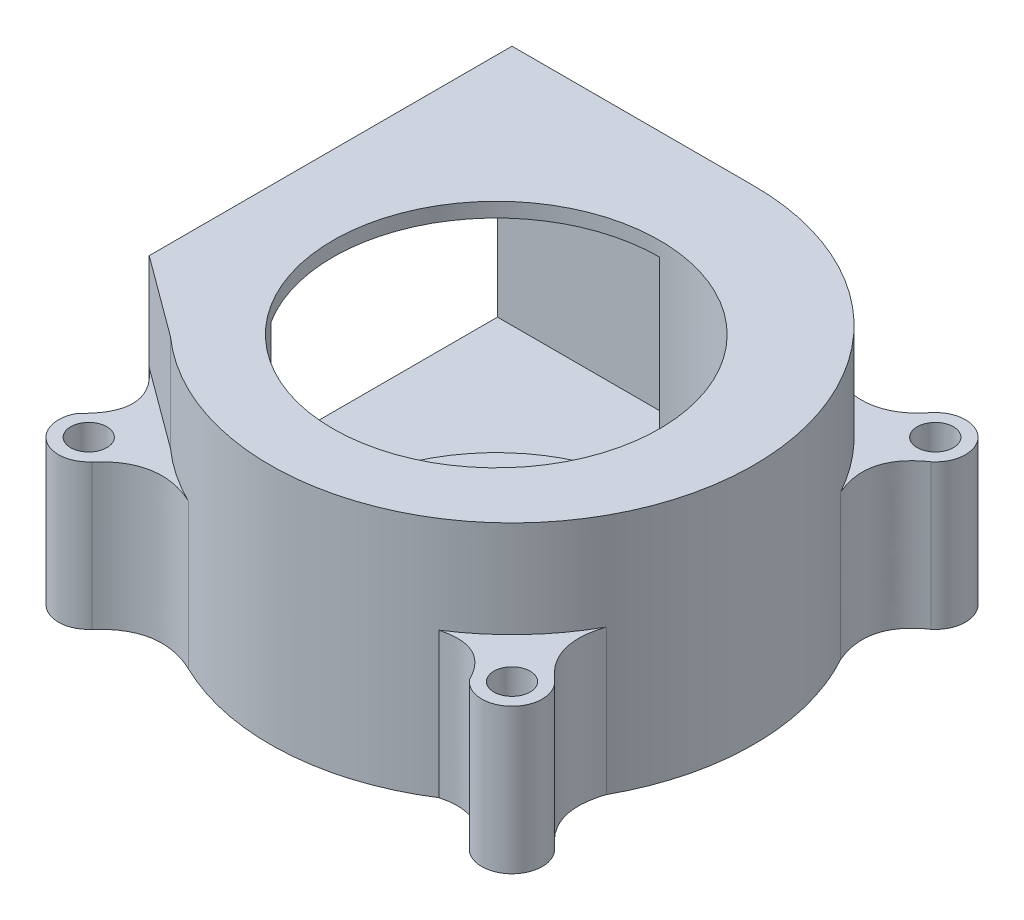
ISO-10303-21;
HEADER;
FILE_DESCRIPTION(('STEP AP214'),'2;1');
FILE_NAME('part.step','',(''),(''),'','','');
FILE_SCHEMA(('AUTOMOTIVE_DESIGN { 1 0 10303 214 1 1 1 1 }'));
ENDSEC;
DATA;
#1=APPLICATION_CONTEXT('core data for automotive mechanical design processes');
#2=APPLICATION_PROTOCOL_DEFINITION('international standard','automotive_design',2000,#1);
#3=PRODUCT_CONTEXT('',#1,'mechanical');
#4=PRODUCT('Part','Part','',(#3));
#5=PRODUCT_RELATED_PRODUCT_CATEGORY('part','',(#4));
#6=PRODUCT_DEFINITION_FORMATION('','',#4);
#7=PRODUCT_DEFINITION_CONTEXT('part definition',#1,'design');
#8=PRODUCT_DEFINITION('design','',#6,#7);
#9=PRODUCT_DEFINITION_SHAPE('','',#8);
#10=(LENGTH_UNIT() NAMED_UNIT(*) SI_UNIT(.MILLI.,.METRE.));
#11=(NAMED_UNIT(*) PLANE_ANGLE_UNIT() SI_UNIT($,.RADIAN.));
#12=(NAMED_UNIT(*) SI_UNIT($,.STERADIAN.) SOLID_ANGLE_UNIT());
#13=UNCERTAINTY_MEASURE_WITH_UNIT(LENGTH_MEASURE(1.E-05),#10,'distance_accuracy_value','');
#14=(GEOMETRIC_REPRESENTATION_CONTEXT(3) GLOBAL_UNCERTAINTY_ASSIGNED_CONTEXT((#13)) GLOBAL_UNIT_ASSIGNED_CONTEXT((#10,
#11,#12)) REPRESENTATION_CONTEXT('',''));
#15=CARTESIAN_POINT('',(0.,0.,0.));
#16=DIRECTION('',(0.,0.,1.));
#17=DIRECTION('',(1.,0.,0.));
#18=AXIS2_PLACEMENT_3D('',#15,#16,#17);
#19=CARTESIAN_POINT('',(0.,20.,0.));
#20=DIRECTION('',(1.,0.,0.));
#21=DIRECTION('',(0.,0.,-1.));
#22=AXIS2_PLACEMENT_3D('',#19,#20,#21);
#23=PLANE('',#22);
#24=DIRECTION('',(0.,0.,1.));
#25=VECTOR('',#24,1.);
#26=CARTESIAN_POINT('',(0.,1.2,-11.5));
#27=LINE('',#26,#25);
#28=CARTESIAN_POINT('',(0.,1.2,-38.8));
#29=VERTEX_POINT('',#28);
#30=CARTESIAN_POINT('',(0.,1.2,-11.5));
#31=VERTEX_POINT('',#30);
#32=EDGE_CURVE('E304',#29,#31,#27,.T.);
#33=ORIENTED_EDGE('',*,*,#32,.F.);
#34=DIRECTION('',(0.,-1.,0.));
#35=VECTOR('',#34,1.);
#36=CARTESIAN_POINT('',(0.,1.2,-38.8));
#37=LINE('',#36,#35);
#38=CARTESIAN_POINT('',(0.,18.8,-38.8));
#39=VERTEX_POINT('',#38);
#40=EDGE_CURVE('E354',#39,#29,#37,.T.);
#41=ORIENTED_EDGE('',*,*,#40,.F.);
#42=DIRECTION('',(0.,0.,-1.));
#43=VECTOR('',#42,1.);
#44=CARTESIAN_POINT('',(0.,18.8,-11.5));
#45=LINE('',#44,#43);
#46=CARTESIAN_POINT('',(0.,18.8,-11.5));
#47=VERTEX_POINT('',#46);
#48=EDGE_CURVE('E356',#47,#39,#45,.T.);
#49=ORIENTED_EDGE('',*,*,#48,.F.);
#50=DIRECTION('',(0.,1.,0.));
#51=VECTOR('',#50,1.);
#52=CARTESIAN_POINT('',(0.,1.2,-11.5));
#53=LINE('',#52,#51);
#54=EDGE_CURVE('E359',#31,#47,#53,.T.);
#55=ORIENTED_EDGE('',*,*,#54,.F.);
#56=EDGE_LOOP('',(#33,#41,#49,#55));
#57=FACE_BOUND('',#56,.T.);
#58=DIRECTION('',(0.,-1.,0.));
#59=VECTOR('',#58,1.);
#60=CARTESIAN_POINT('',(0.,20.,-40.));
#61=LINE('',#60,#59);
#62=CARTESIAN_POINT('',(0.,20.,-40.));
#63=VERTEX_POINT('',#62);
#64=CARTESIAN_POINT('',(0.,0.,-40.));
#65=VERTEX_POINT('',#64);
#66=EDGE_CURVE('E46',#63,#65,#61,.T.);
#67=ORIENTED_EDGE('',*,*,#66,.T.);
#68=DIRECTION('',(0.,0.,1.));
#69=VECTOR('',#68,1.);
#70=CARTESIAN_POINT('',(0.,0.,0.));
#71=LINE('',#70,#69);
#72=CARTESIAN_POINT('',(0.,0.,-10.));
#73=VERTEX_POINT('',#72);
#74=EDGE_CURVE('E311',#65,#73,#71,.T.);
#75=ORIENTED_EDGE('',*,*,#74,.T.);
#76=DIRECTION('',(0.,1.,0.));
#77=VECTOR('',#76,1.);
#78=CARTESIAN_POINT('',(0.,0.,-10.));
#79=LINE('',#78,#77);
#80=CARTESIAN_POINT('',(0.,12.,-10.));
#81=VERTEX_POINT('',#80);
#82=EDGE_CURVE('E400',#73,#81,#79,.T.);
#83=ORIENTED_EDGE('',*,*,#82,.T.);
#84=DIRECTION('',(0.,1.,0.));
#85=VECTOR('',#84,1.);
#86=CARTESIAN_POINT('',(0.,12.,-10.));
#87=LINE('',#86,#85);
#88=CARTESIAN_POINT('',(0.,20.,-10.));
#89=VERTEX_POINT('',#88);
#90=EDGE_CURVE('E379',#81,#89,#87,.T.);
#91=ORIENTED_EDGE('',*,*,#90,.T.);
#92=DIRECTION('',(0.,0.,1.));
#93=VECTOR('',#92,1.);
#94=CARTESIAN_POINT('',(0.,20.,0.));
#95=LINE('',#94,#93);
#96=EDGE_CURVE('E314',#63,#89,#95,.T.);
#97=ORIENTED_EDGE('',*,*,#96,.F.);
#98=EDGE_LOOP('',(#67,#75,#83,#91,#97));
#99=FACE_BOUND('',#98,.T.);
#100=ADVANCED_FACE('F39',(#57,#99),#23,.F.);
#101=CARTESIAN_POINT('',(0.,0.,0.));
#102=DIRECTION('',(0.,-1.,0.));
#103=DIRECTION('',(0.,0.,-1.));
#104=AXIS2_PLACEMENT_3D('',#101,#102,#103);
#105=PLANE('',#104);
#106=CARTESIAN_POINT('',(37.5,0.,-2.5));
#107=DIRECTION('',(0.,1.,0.));
#108=DIRECTION('',(0.,0.,1.));
#109=AXIS2_PLACEMENT_3D('',#106,#107,#108);
#110=CIRCLE('',#109,1.5);
#111=CARTESIAN_POINT('',(37.5,0.,-1.));
#112=VERTEX_POINT('',#111);
#113=EDGE_CURVE('E332',#112,#112,#110,.T.);
#114=ORIENTED_EDGE('',*,*,#113,.T.);
#115=EDGE_LOOP('',(#114));
#116=FACE_BOUND('',#115,.T.);
#117=CARTESIAN_POINT('',(2.5,0.,-2.5));
#118=DIRECTION('',(0.,1.,0.));
#119=DIRECTION('',(0.,0.,1.));
#120=AXIS2_PLACEMENT_3D('',#117,#118,#119);
#121=CIRCLE('',#120,1.5);
#122=CARTESIAN_POINT('',(2.5,0.,-1.));
#123=VERTEX_POINT('',#122);
#124=EDGE_CURVE('E329',#123,#123,#121,.T.);
#125=ORIENTED_EDGE('',*,*,#124,.T.);
#126=EDGE_LOOP('',(#125));
#127=FACE_BOUND('',#126,.T.);
#128=CARTESIAN_POINT('',(37.4999999999999,0.,-37.5));
#129=DIRECTION('',(0.,1.,0.));
#130=DIRECTION('',(0.,0.,1.));
#131=AXIS2_PLACEMENT_3D('',#128,#129,#130);
#132=CIRCLE('',#131,1.5);
#133=CARTESIAN_POINT('',(37.4999999999999,0.,-36.));
#134=VERTEX_POINT('',#133);
#135=EDGE_CURVE('E339',#134,#134,#132,.T.);
#136=ORIENTED_EDGE('',*,*,#135,.T.);
#137=EDGE_LOOP('',(#136));
#138=FACE_BOUND('',#137,.T.);
#139=CARTESIAN_POINT('',(2.5,0.,-2.5));
#140=DIRECTION('',(0.,1.,0.));
#141=DIRECTION('',(0.,0.,1.));
#142=AXIS2_PLACEMENT_3D('',#139,#140,#141);
#143=CIRCLE('',#142,2.5);
#144=CARTESIAN_POINT('',(0.33982623590468,0.,-3.75843128891261));
#145=VERTEX_POINT('',#144);
#146=CARTESIAN_POINT('',(4.40068462966539,0.,-0.875993245533221));
#147=VERTEX_POINT('',#146);
#148=EDGE_CURVE('E536',#145,#147,#143,.T.);
#149=ORIENTED_EDGE('',*,*,#148,.F.);
#150=CARTESIAN_POINT('',(0.,0.,-10.));
#151=CARTESIAN_POINT('',(3.63880693250403,0.,-6.87843186226279));
#152=CARTESIAN_POINT('',(0.33982623590468,0.,-3.75843128891261));
#153=B_SPLINE_CURVE_WITH_KNOTS('',2,(#150,#151,#152),.UNSPECIFIED.,.F.,.F.,(3,3),(0.,1.),.UNSPECIFIED.);
#154=EDGE_CURVE('E328',#73,#145,#153,.T.);
#155=ORIENTED_EDGE('',*,*,#154,.F.);
#156=ORIENTED_EDGE('',*,*,#74,.F.);
#157=DIRECTION('',(-1.,0.,0.));
#158=VECTOR('',#157,1.);
#159=CARTESIAN_POINT('',(0.,0.,-40.));
#160=LINE('',#159,#158);
#161=CARTESIAN_POINT('',(20.,0.,-40.));
#162=VERTEX_POINT('',#161);
#163=EDGE_CURVE('E318',#162,#65,#160,.T.);
#164=ORIENTED_EDGE('',*,*,#163,.F.);
#165=CARTESIAN_POINT('',(20.,0.,-20.));
#166=DIRECTION('',(0.,1.,0.));
#167=DIRECTION('',(0.,0.,1.));
#168=AXIS2_PLACEMENT_3D('',#165,#166,#167);
#169=CIRCLE('',#168,20.);
#170=CARTESIAN_POINT('',(29.6824583655185,0.,-37.5));
#171=VERTEX_POINT('',#170);
#172=EDGE_CURVE('E218',#171,#162,#169,.T.);
#173=ORIENTED_EDGE('',*,*,#172,.F.);
#174=CARTESIAN_POINT('',(35.5993153703346,0.,-39.1240067544669));
#175=CARTESIAN_POINT('',(33.3343477435317,0.,-36.2155128726045));
#176=CARTESIAN_POINT('',(29.6824583655185,0.,-37.5));
#177=B_SPLINE_CURVE_WITH_KNOTS('',2,(#174,#175,#176),.UNSPECIFIED.,.F.,.F.,(3,3),(0.,1.),.UNSPECIFIED.);
#178=CARTESIAN_POINT('',(35.5993153703346,0.,-39.1240067544669));
#179=VERTEX_POINT('',#178);
#180=EDGE_CURVE('E212',#179,#171,#177,.T.);
#181=ORIENTED_EDGE('',*,*,#180,.F.);
#182=CARTESIAN_POINT('',(37.4999999999999,0.,-37.5));
#183=DIRECTION('',(0.,1.,0.));
#184=DIRECTION('',(0.,0.,1.));
#185=AXIS2_PLACEMENT_3D('',#182,#183,#184);
#186=CIRCLE('',#185,2.5);
#187=CARTESIAN_POINT('',(39.0764359702884,0.,-35.5596779567349));
#188=VERTEX_POINT('',#187);
#189=EDGE_CURVE('E401',#188,#179,#186,.T.);
#190=ORIENTED_EDGE('',*,*,#189,.F.);
#191=CARTESIAN_POINT('',(37.4999999999999,0.,-29.6824583655188));
#192=CARTESIAN_POINT('',(35.9251022072649,0.,-33.3910795895025));
#193=CARTESIAN_POINT('',(39.0764359702884,0.,-35.5596779567349));
#194=B_SPLINE_CURVE_WITH_KNOTS('',2,(#191,#192,#193),.UNSPECIFIED.,.F.,.F.,(3,3),(0.,1.),.UNSPECIFIED.);
#195=CARTESIAN_POINT('',(37.4999999999999,0.,-29.6824583655188));
#196=VERTEX_POINT('',#195);
#197=EDGE_CURVE('E478',#196,#188,#194,.T.);
#198=ORIENTED_EDGE('',*,*,#197,.F.);
#199=CARTESIAN_POINT('',(20.,0.,-20.));
#200=DIRECTION('',(0.,1.,0.));
#201=DIRECTION('',(0.,0.,1.));
#202=AXIS2_PLACEMENT_3D('',#199,#200,#201);
#203=CIRCLE('',#202,20.);
#204=CARTESIAN_POINT('',(37.5,0.,-10.3175416344815));
#205=VERTEX_POINT('',#204);
#206=EDGE_CURVE('E484',#205,#196,#203,.T.);
#207=ORIENTED_EDGE('',*,*,#206,.F.);
#208=CARTESIAN_POINT('',(39.1800730864326,0.,-4.35131154164954));
#209=CARTESIAN_POINT('',(36.3197620193784,0.,-6.76565139912462));
#210=CARTESIAN_POINT('',(37.5,0.,-10.3175416344815));
#211=B_SPLINE_CURVE_WITH_KNOTS('',2,(#208,#209,#210),.UNSPECIFIED.,.F.,.F.,(3,3),(0.,1.),.UNSPECIFIED.);
#212=CARTESIAN_POINT('',(39.1800730864326,0.,-4.35131154164954));
#213=VERTEX_POINT('',#212);
#214=EDGE_CURVE('E502',#213,#205,#211,.T.);
#215=ORIENTED_EDGE('',*,*,#214,.F.);
#216=CARTESIAN_POINT('',(37.5,0.,-2.5));
#217=DIRECTION('',(0.,1.,0.));
#218=DIRECTION('',(0.,0.,1.));
#219=AXIS2_PLACEMENT_3D('',#216,#217,#218);
#220=CIRCLE('',#219,2.49999999999999);
#221=CARTESIAN_POINT('',(35.5993153703346,0.,-0.875993245533222));
#222=VERTEX_POINT('',#221);
#223=EDGE_CURVE('E508',#222,#213,#220,.T.);
#224=ORIENTED_EDGE('',*,*,#223,.F.);
#225=CARTESIAN_POINT('',(30.7946243048797,0.,-3.16325191384923));
#226=CARTESIAN_POINT('',(34.0639481750097,0.,-4.03588932414524));
#227=CARTESIAN_POINT('',(35.5993153703346,0.,-0.875993245533222));
#228=B_SPLINE_CURVE_WITH_KNOTS('',2,(#225,#226,#227),.UNSPECIFIED.,.F.,.F.,(3,3),(0.,1.),.UNSPECIFIED.);
#229=CARTESIAN_POINT('',(30.7946243048797,0.,-3.16325191384924));
#230=VERTEX_POINT('',#229);
#231=EDGE_CURVE('E513',#230,#222,#228,.T.);
#232=ORIENTED_EDGE('',*,*,#231,.F.);
#233=CARTESIAN_POINT('',(20.,0.,-20.));
#234=DIRECTION('',(0.,1.,0.));
#235=DIRECTION('',(0.,0.,1.));
#236=AXIS2_PLACEMENT_3D('',#233,#234,#235);
#237=CIRCLE('',#236,20.);
#238=CARTESIAN_POINT('',(11.2002766867621,0.,-2.03990897544066));
#239=VERTEX_POINT('',#238);
#240=EDGE_CURVE('E519',#239,#230,#237,.T.);
#241=ORIENTED_EDGE('',*,*,#240,.F.);
#242=CARTESIAN_POINT('',(4.40068462966539,0.,-0.875993245533222));
#243=CARTESIAN_POINT('',(7.14389671129235,0.,-3.95245297471034));
#244=CARTESIAN_POINT('',(11.2002766867621,0.,-2.03990897544066));
#245=B_SPLINE_CURVE_WITH_KNOTS('',2,(#242,#243,#244),.UNSPECIFIED.,.F.,.F.,(3,3),(0.,1.),.UNSPECIFIED.);
#246=EDGE_CURVE('E530',#147,#239,#245,.T.);
#247=ORIENTED_EDGE('',*,*,#246,.F.);
#248=EDGE_LOOP('',(#149,#155,#156,#164,#173,#181,#190,#198,#207,#215,#224,#232,#241,#247));
#249=FACE_BOUND('',#248,.T.);
#250=ADVANCED_FACE('F287',(#116,#127,#138,#249),#105,.T.);
#251=CARTESIAN_POINT('',(0.,20.,-40.));
#252=DIRECTION('',(0.,0.,1.));
#253=DIRECTION('',(1.,0.,0.));
#254=AXIS2_PLACEMENT_3D('',#251,#252,#253);
#255=PLANE('',#254);
#256=DIRECTION('',(0.,1.,0.));
#257=VECTOR('',#256,1.);
#258=CARTESIAN_POINT('',(20.,12.,-40.));
#259=LINE('',#258,#257);
#260=CARTESIAN_POINT('',(20.,20.,-40.));
#261=VERTEX_POINT('',#260);
#262=EDGE_CURVE('E320',#162,#261,#259,.T.);
#263=ORIENTED_EDGE('',*,*,#262,.F.);
#264=ORIENTED_EDGE('',*,*,#163,.T.);
#265=ORIENTED_EDGE('',*,*,#66,.F.);
#266=DIRECTION('',(-1.,0.,0.));
#267=VECTOR('',#266,1.);
#268=CARTESIAN_POINT('',(0.,20.,-40.));
#269=LINE('',#268,#267);
#270=EDGE_CURVE('E316',#261,#63,#269,.T.);
#271=ORIENTED_EDGE('',*,*,#270,.F.);
#272=EDGE_LOOP('',(#263,#264,#265,#271));
#273=FACE_BOUND('',#272,.T.);
#274=ADVANCED_FACE('F247',(#273),#255,.F.);
#275=CARTESIAN_POINT('',(20.,12.,-20.));
#276=DIRECTION('',(0.,1.,0.));
#277=DIRECTION('',(0.,0.,1.));
#278=AXIS2_PLACEMENT_3D('',#275,#276,#277);
#279=PLANE('',#278);
#280=CARTESIAN_POINT('',(2.5,12.,-2.5));
#281=DIRECTION('',(0.,1.,0.));
#282=DIRECTION('',(0.,0.,1.));
#283=AXIS2_PLACEMENT_3D('',#280,#281,#282);
#284=CIRCLE('',#283,1.5);
#285=CARTESIAN_POINT('',(2.5,12.,-1.));
#286=VERTEX_POINT('',#285);
#287=EDGE_CURVE('E369',#286,#286,#284,.T.);
#288=ORIENTED_EDGE('',*,*,#287,.F.);
#289=EDGE_LOOP('',(#288));
#290=FACE_BOUND('',#289,.T.);
#291=CARTESIAN_POINT('',(2.5,12.,-2.5));
#292=DIRECTION('',(0.,1.,0.));
#293=DIRECTION('',(0.,0.,1.));
#294=AXIS2_PLACEMENT_3D('',#291,#292,#293);
#295=CIRCLE('',#294,2.5);
#296=CARTESIAN_POINT('',(0.33982623590468,12.,-3.75843128891261));
#297=VERTEX_POINT('',#296);
#298=CARTESIAN_POINT('',(4.40068462966539,12.,-0.875993245533221));
#299=VERTEX_POINT('',#298);
#300=EDGE_CURVE('E457',#297,#299,#295,.T.);
#301=ORIENTED_EDGE('',*,*,#300,.T.);
#302=CARTESIAN_POINT('',(4.40068462966539,12.,-0.875993245533222));
#303=CARTESIAN_POINT('',(7.14389671129235,12.,-3.95245297471034));
#304=CARTESIAN_POINT('',(11.2002766867621,12.,-2.03990897544066));
#305=B_SPLINE_CURVE_WITH_KNOTS('',2,(#302,#303,#304),.UNSPECIFIED.,.F.,.F.,(3,3),(0.,1.),.UNSPECIFIED.);
#306=CARTESIAN_POINT('',(11.2002766867621,12.,-2.03990897544066));
#307=VERTEX_POINT('',#306);
#308=EDGE_CURVE('E449',#299,#307,#305,.T.);
#309=ORIENTED_EDGE('',*,*,#308,.T.);
#310=CARTESIAN_POINT('',(20.,12.,-20.));
#311=DIRECTION('',(0.,1.,0.));
#312=DIRECTION('',(0.,0.,1.));
#313=AXIS2_PLACEMENT_3D('',#310,#311,#312);
#314=CIRCLE('',#313,20.);
#315=CARTESIAN_POINT('',(6.69258254268261,12.,-5.06974077195293));
#316=VERTEX_POINT('',#315);
#317=EDGE_CURVE('E382',#316,#307,#314,.T.);
#318=ORIENTED_EDGE('',*,*,#317,.F.);
#319=DIRECTION('',(0.805120026743489,0.,0.593111914006592));
#320=VECTOR('',#319,1.);
#321=CARTESIAN_POINT('',(0.,12.,-10.));
#322=LINE('',#321,#320);
#323=EDGE_CURVE('E387',#81,#316,#322,.T.);
#324=ORIENTED_EDGE('',*,*,#323,.F.);
#325=CARTESIAN_POINT('',(0.,12.,-10.));
#326=CARTESIAN_POINT('',(3.63880693250403,12.,-6.87843186226279));
#327=CARTESIAN_POINT('',(0.33982623590468,12.,-3.75843128891261));
#328=B_SPLINE_CURVE_WITH_KNOTS('',2,(#325,#326,#327),.UNSPECIFIED.,.F.,.F.,(3,3),(0.,1.),.UNSPECIFIED.);
#329=EDGE_CURVE('E462',#81,#297,#328,.T.);
#330=ORIENTED_EDGE('',*,*,#329,.T.);
#331=EDGE_LOOP('',(#301,#309,#318,#324,#330));
#332=FACE_BOUND('',#331,.T.);
#333=ADVANCED_FACE('F243',(#290,#332),#279,.T.);
#334=CARTESIAN_POINT('',(37.5,12.,-2.5));
#335=DIRECTION('',(0.,1.,0.));
#336=DIRECTION('',(0.,0.,1.));
#337=AXIS2_PLACEMENT_3D('',#334,#335,#336);
#338=CIRCLE('',#337,1.5);
#339=CARTESIAN_POINT('',(37.5,12.,-1.));
#340=VERTEX_POINT('',#339);
#341=EDGE_CURVE('E373',#340,#340,#338,.T.);
#342=ORIENTED_EDGE('',*,*,#341,.F.);
#343=EDGE_LOOP('',(#342));
#344=FACE_BOUND('',#343,.T.);
#345=CARTESIAN_POINT('',(37.5,12.,-2.5));
#346=DIRECTION('',(0.,1.,0.));
#347=DIRECTION('',(0.,0.,1.));
#348=AXIS2_PLACEMENT_3D('',#345,#346,#347);
#349=CIRCLE('',#348,2.49999999999999);
#350=CARTESIAN_POINT('',(35.5993153703346,12.,-0.875993245533222));
#351=VERTEX_POINT('',#350);
#352=CARTESIAN_POINT('',(39.1800730864326,12.,-4.35131154164954));
#353=VERTEX_POINT('',#352);
#354=EDGE_CURVE('E439',#351,#353,#349,.T.);
#355=ORIENTED_EDGE('',*,*,#354,.T.);
#356=CARTESIAN_POINT('',(39.1800730864326,12.,-4.35131154164954));
#357=CARTESIAN_POINT('',(36.3197620193784,12.,-6.76565139912462));
#358=CARTESIAN_POINT('',(37.5,12.,-10.3175416344815));
#359=B_SPLINE_CURVE_WITH_KNOTS('',2,(#356,#357,#358),.UNSPECIFIED.,.F.,.F.,(3,3),(0.,1.),.UNSPECIFIED.);
#360=CARTESIAN_POINT('',(37.5,12.,-10.3175416344815));
#361=VERTEX_POINT('',#360);
#362=EDGE_CURVE('E431',#353,#361,#359,.T.);
#363=ORIENTED_EDGE('',*,*,#362,.T.);
#364=CARTESIAN_POINT('',(30.7946243048797,12.,-3.16325191384924));
#365=VERTEX_POINT('',#364);
#366=EDGE_CURVE('E394',#365,#361,#314,.T.);
#367=ORIENTED_EDGE('',*,*,#366,.F.);
#368=CARTESIAN_POINT('',(30.7946243048797,12.,-3.16325191384923));
#369=CARTESIAN_POINT('',(34.0639481750097,12.,-4.03588932414524));
#370=CARTESIAN_POINT('',(35.5993153703346,12.,-0.875993245533222));
#371=B_SPLINE_CURVE_WITH_KNOTS('',2,(#368,#369,#370),.UNSPECIFIED.,.F.,.F.,(3,3),(0.,1.),.UNSPECIFIED.);
#372=EDGE_CURVE('E444',#365,#351,#371,.T.);
#373=ORIENTED_EDGE('',*,*,#372,.T.);
#374=EDGE_LOOP('',(#355,#363,#367,#373));
#375=FACE_BOUND('',#374,.T.);
#376=ADVANCED_FACE('F246',(#344,#375),#279,.T.);
#377=CARTESIAN_POINT('',(37.4999999999999,12.,-37.5));
#378=DIRECTION('',(0.,1.,0.));
#379=DIRECTION('',(0.,0.,1.));
#380=AXIS2_PLACEMENT_3D('',#377,#378,#379);
#381=CIRCLE('',#380,1.5);
#382=CARTESIAN_POINT('',(37.4999999999999,12.,-36.));
#383=VERTEX_POINT('',#382);
#384=EDGE_CURVE('E376',#383,#383,#381,.T.);
#385=ORIENTED_EDGE('',*,*,#384,.F.);
#386=EDGE_LOOP('',(#385));
#387=FACE_BOUND('',#386,.T.);
#388=CARTESIAN_POINT('',(37.4999999999999,12.,-37.5));
#389=DIRECTION('',(0.,1.,0.));
#390=DIRECTION('',(0.,0.,1.));
#391=AXIS2_PLACEMENT_3D('',#388,#389,#390);
#392=CIRCLE('',#391,2.5);
#393=CARTESIAN_POINT('',(39.0764359702884,12.,-35.5596779567349));
#394=VERTEX_POINT('',#393);
#395=CARTESIAN_POINT('',(35.5993153703346,12.,-39.1240067544669));
#396=VERTEX_POINT('',#395);
#397=EDGE_CURVE('E219',#394,#396,#392,.T.);
#398=ORIENTED_EDGE('',*,*,#397,.T.);
#399=CARTESIAN_POINT('',(35.5993153703346,12.,-39.1240067544669));
#400=CARTESIAN_POINT('',(33.3343477435317,12.,-36.2155128726045));
#401=CARTESIAN_POINT('',(29.6824583655185,12.,-37.5));
#402=B_SPLINE_CURVE_WITH_KNOTS('',2,(#399,#400,#401),.UNSPECIFIED.,.F.,.F.,(3,3),(0.,1.),.UNSPECIFIED.);
#403=CARTESIAN_POINT('',(29.6824583655185,12.,-37.5));
#404=VERTEX_POINT('',#403);
#405=EDGE_CURVE('E211',#396,#404,#402,.T.);
#406=ORIENTED_EDGE('',*,*,#405,.T.);
#407=CARTESIAN_POINT('',(37.4999999999999,12.,-29.6824583655188));
#408=VERTEX_POINT('',#407);
#409=EDGE_CURVE('E395',#408,#404,#314,.T.);
#410=ORIENTED_EDGE('',*,*,#409,.F.);
#411=CARTESIAN_POINT('',(37.4999999999999,12.,-29.6824583655188));
#412=CARTESIAN_POINT('',(35.9251022072649,12.,-33.3910795895025));
#413=CARTESIAN_POINT('',(39.0764359702884,12.,-35.5596779567349));
#414=B_SPLINE_CURVE_WITH_KNOTS('',2,(#411,#412,#413),.UNSPECIFIED.,.F.,.F.,(3,3),(0.,1.),.UNSPECIFIED.);
#415=EDGE_CURVE('E426',#408,#394,#414,.T.);
#416=ORIENTED_EDGE('',*,*,#415,.T.);
#417=EDGE_LOOP('',(#398,#406,#410,#416));
#418=FACE_BOUND('',#417,.T.);
#419=ADVANCED_FACE('F249',(#387,#418),#279,.T.);
#420=CARTESIAN_POINT('',(0.,20.,0.));
#421=DIRECTION('',(0.,-1.,0.));
#422=DIRECTION('',(0.,0.,-1.));
#423=AXIS2_PLACEMENT_3D('',#420,#421,#422);
#424=PLANE('',#423);
#425=CARTESIAN_POINT('',(20.,20.,-18.7));
#426=DIRECTION('',(0.,1.,0.));
#427=DIRECTION('',(0.,0.,1.));
#428=AXIS2_PLACEMENT_3D('',#425,#426,#427);
#429=CIRCLE('',#428,13.5);
#430=CARTESIAN_POINT('',(20.,20.,-5.19999999999999));
#431=VERTEX_POINT('',#430);
#432=EDGE_CURVE('E197',#431,#431,#429,.T.);
#433=ORIENTED_EDGE('',*,*,#432,.F.);
#434=EDGE_LOOP('',(#433));
#435=FACE_BOUND('',#434,.T.);
#436=CARTESIAN_POINT('',(20.,20.,-20.));
#437=DIRECTION('',(0.,1.,0.));
#438=DIRECTION('',(0.,0.,1.));
#439=AXIS2_PLACEMENT_3D('',#436,#437,#438);
#440=CIRCLE('',#439,20.);
#441=CARTESIAN_POINT('',(6.69258254268261,20.,-5.06974077195294));
#442=VERTEX_POINT('',#441);
#443=EDGE_CURVE('E385',#442,#261,#440,.T.);
#444=ORIENTED_EDGE('',*,*,#443,.T.);
#445=ORIENTED_EDGE('',*,*,#270,.T.);
#446=ORIENTED_EDGE('',*,*,#96,.T.);
#447=DIRECTION('',(0.805120026743489,0.,0.593111914006592));
#448=VECTOR('',#447,1.);
#449=CARTESIAN_POINT('',(0.,20.,-10.));
#450=LINE('',#449,#448);
#451=EDGE_CURVE('E388',#89,#442,#450,.T.);
#452=ORIENTED_EDGE('',*,*,#451,.T.);
#453=EDGE_LOOP('',(#444,#445,#446,#452));
#454=FACE_BOUND('',#453,.T.);
#455=ADVANCED_FACE('F282',(#435,#454),#424,.F.);
#456=CARTESIAN_POINT('',(2.5,20.,-2.5));
#457=DIRECTION('',(0.,-1.,0.));
#458=DIRECTION('',(0.,0.,-1.));
#459=AXIS2_PLACEMENT_3D('',#456,#457,#458);
#460=CYLINDRICAL_SURFACE('',#459,1.5);
#461=ORIENTED_EDGE('',*,*,#124,.F.);
#462=EDGE_LOOP('',(#461));
#463=FACE_BOUND('',#462,.T.);
#464=ORIENTED_EDGE('',*,*,#287,.T.);
#465=EDGE_LOOP('',(#464));
#466=FACE_BOUND('',#465,.T.);
#467=ADVANCED_FACE('F278',(#463,#466),#460,.F.);
#468=CARTESIAN_POINT('',(37.5,20.,-2.5));
#469=DIRECTION('',(0.,-1.,0.));
#470=DIRECTION('',(0.,0.,-1.));
#471=AXIS2_PLACEMENT_3D('',#468,#469,#470);
#472=CYLINDRICAL_SURFACE('',#471,1.5);
#473=ORIENTED_EDGE('',*,*,#113,.F.);
#474=EDGE_LOOP('',(#473));
#475=FACE_BOUND('',#474,.T.);
#476=ORIENTED_EDGE('',*,*,#341,.T.);
#477=EDGE_LOOP('',(#476));
#478=FACE_BOUND('',#477,.T.);
#479=ADVANCED_FACE('F274',(#475,#478),#472,.F.);
#480=CARTESIAN_POINT('',(37.4999999999999,20.,-37.5));
#481=DIRECTION('',(0.,-1.,0.));
#482=DIRECTION('',(0.,0.,-1.));
#483=AXIS2_PLACEMENT_3D('',#480,#481,#482);
#484=CYLINDRICAL_SURFACE('',#483,1.5);
#485=ORIENTED_EDGE('',*,*,#135,.F.);
#486=EDGE_LOOP('',(#485));
#487=FACE_BOUND('',#486,.T.);
#488=ORIENTED_EDGE('',*,*,#384,.T.);
#489=EDGE_LOOP('',(#488));
#490=FACE_BOUND('',#489,.T.);
#491=ADVANCED_FACE('F271',(#487,#490),#484,.F.);
#492=CARTESIAN_POINT('',(20.,1.2,-11.5));
#493=DIRECTION('',(0.,0.,1.));
#494=DIRECTION('',(1.,0.,0.));
#495=AXIS2_PLACEMENT_3D('',#492,#493,#494);
#496=PLANE('',#495);
#497=DIRECTION('',(0.,1.,0.));
#498=VECTOR('',#497,1.);
#499=CARTESIAN_POINT('',(8.58028021359542,2.,-11.5));
#500=LINE('',#499,#498);
#501=CARTESIAN_POINT('',(8.58028021359542,18.8,-11.5));
#502=VERTEX_POINT('',#501);
#503=CARTESIAN_POINT('',(8.58028021359542,2.,-11.5));
#504=VERTEX_POINT('',#503);
#505=EDGE_CURVE('E361',#502,#504,#500,.F.);
#506=ORIENTED_EDGE('',*,*,#505,.T.);
#507=DIRECTION('',(0.,1.,0.));
#508=VECTOR('',#507,1.);
#509=CARTESIAN_POINT('',(8.58028021359542,0.,-11.5));
#510=LINE('',#509,#508);
#511=CARTESIAN_POINT('',(8.58028021359542,1.2,-11.5));
#512=VERTEX_POINT('',#511);
#513=EDGE_CURVE('E53',#504,#512,#510,.F.);
#514=ORIENTED_EDGE('',*,*,#513,.T.);
#515=DIRECTION('',(-1.,0.,0.));
#516=VECTOR('',#515,1.);
#517=CARTESIAN_POINT('',(20.,1.2,-11.5));
#518=LINE('',#517,#516);
#519=EDGE_CURVE('E342',#512,#31,#518,.T.);
#520=ORIENTED_EDGE('',*,*,#519,.T.);
#521=ORIENTED_EDGE('',*,*,#54,.T.);
#522=DIRECTION('',(-1.,0.,0.));
#523=VECTOR('',#522,1.);
#524=CARTESIAN_POINT('',(20.,18.8,-11.5));
#525=LINE('',#524,#523);
#526=EDGE_CURVE('E343',#502,#47,#525,.T.);
#527=ORIENTED_EDGE('',*,*,#526,.F.);
#528=EDGE_LOOP('',(#506,#514,#520,#521,#527));
#529=FACE_BOUND('',#528,.T.);
#530=ADVANCED_FACE('F262',(#529),#496,.F.);
#531=CARTESIAN_POINT('',(20.,1.2,-11.5));
#532=DIRECTION('',(0.,-1.,0.));
#533=DIRECTION('',(0.,0.,-1.));
#534=AXIS2_PLACEMENT_3D('',#531,#532,#533);
#535=PLANE('',#534);
#536=ORIENTED_EDGE('',*,*,#519,.F.);
#537=CARTESIAN_POINT('',(20.,1.2,-18.7));
#538=DIRECTION('',(0.,-1.,0.));
#539=DIRECTION('',(0.,0.,-1.));
#540=AXIS2_PLACEMENT_3D('',#537,#538,#539);
#541=CIRCLE('',#540,13.5);
#542=CARTESIAN_POINT('',(20.,1.2,-32.2));
#543=VERTEX_POINT('',#542);
#544=EDGE_CURVE('E60',#512,#543,#541,.T.);
#545=ORIENTED_EDGE('',*,*,#544,.T.);
#546=DIRECTION('',(0.,0.,1.));
#547=VECTOR('',#546,1.);
#548=CARTESIAN_POINT('',(20.,1.2,-11.5));
#549=LINE('',#548,#547);
#550=CARTESIAN_POINT('',(20.,1.2,-38.8));
#551=VERTEX_POINT('',#550);
#552=EDGE_CURVE('E203',#551,#543,#549,.T.);
#553=ORIENTED_EDGE('',*,*,#552,.F.);
#554=DIRECTION('',(-1.,0.,0.));
#555=VECTOR('',#554,1.);
#556=CARTESIAN_POINT('',(20.,1.2,-38.8));
#557=LINE('',#556,#555);
#558=EDGE_CURVE('E348',#551,#29,#557,.T.);
#559=ORIENTED_EDGE('',*,*,#558,.T.);
#560=ORIENTED_EDGE('',*,*,#32,.T.);
#561=EDGE_LOOP('',(#536,#545,#553,#559,#560));
#562=FACE_BOUND('',#561,.T.);
#563=ADVANCED_FACE('F258',(#562),#535,.F.);
#564=CARTESIAN_POINT('',(20.,1.2,-38.8));
#565=DIRECTION('',(0.,0.,-1.));
#566=DIRECTION('',(-1.,0.,0.));
#567=AXIS2_PLACEMENT_3D('',#564,#565,#566);
#568=PLANE('',#567);
#569=ORIENTED_EDGE('',*,*,#40,.T.);
#570=ORIENTED_EDGE('',*,*,#558,.F.);
#571=DIRECTION('',(0.,-1.,0.));
#572=VECTOR('',#571,1.);
#573=CARTESIAN_POINT('',(20.,1.2,-38.8));
#574=LINE('',#573,#572);
#575=CARTESIAN_POINT('',(20.,18.8,-38.8));
#576=VERTEX_POINT('',#575);
#577=EDGE_CURVE('E363',#576,#551,#574,.T.);
#578=ORIENTED_EDGE('',*,*,#577,.F.);
#579=DIRECTION('',(-1.,0.,0.));
#580=VECTOR('',#579,1.);
#581=CARTESIAN_POINT('',(20.,18.8,-38.8));
#582=LINE('',#581,#580);
#583=EDGE_CURVE('E346',#576,#39,#582,.T.);
#584=ORIENTED_EDGE('',*,*,#583,.T.);
#585=EDGE_LOOP('',(#569,#570,#578,#584));
#586=FACE_BOUND('',#585,.T.);
#587=ADVANCED_FACE('F261',(#586),#568,.F.);
#588=CARTESIAN_POINT('',(20.,18.8,-11.5));
#589=DIRECTION('',(0.,1.,0.));
#590=DIRECTION('',(0.,0.,1.));
#591=AXIS2_PLACEMENT_3D('',#588,#589,#590);
#592=PLANE('',#591);
#593=DIRECTION('',(0.,0.,-1.));
#594=VECTOR('',#593,1.);
#595=CARTESIAN_POINT('',(20.,18.8,-11.5));
#596=LINE('',#595,#594);
#597=CARTESIAN_POINT('',(20.,18.8,-32.2));
#598=VERTEX_POINT('',#597);
#599=EDGE_CURVE('E353',#598,#576,#596,.T.);
#600=ORIENTED_EDGE('',*,*,#599,.F.);
#601=CARTESIAN_POINT('',(20.,18.8,-18.7));
#602=DIRECTION('',(0.,1.,0.));
#603=DIRECTION('',(0.,0.,1.));
#604=AXIS2_PLACEMENT_3D('',#601,#602,#603);
#605=CIRCLE('',#604,13.5);
#606=EDGE_CURVE('E188',#598,#502,#605,.T.);
#607=ORIENTED_EDGE('',*,*,#606,.T.);
#608=ORIENTED_EDGE('',*,*,#526,.T.);
#609=ORIENTED_EDGE('',*,*,#48,.T.);
#610=ORIENTED_EDGE('',*,*,#583,.F.);
#611=EDGE_LOOP('',(#600,#607,#608,#609,#610));
#612=FACE_BOUND('',#611,.T.);
#613=ADVANCED_FACE('F257',(#612),#592,.F.);
#614=CARTESIAN_POINT('',(20.,0.,0.));
#615=DIRECTION('',(-1.,0.,0.));
#616=DIRECTION('',(0.,0.,1.));
#617=AXIS2_PLACEMENT_3D('',#614,#615,#616);
#618=PLANE('',#617);
#619=DIRECTION('',(0.,1.,0.));
#620=VECTOR('',#619,1.);
#621=CARTESIAN_POINT('',(20.,0.,-32.2));
#622=LINE('',#621,#620);
#623=CARTESIAN_POINT('',(20.,2.,-32.2));
#624=VERTEX_POINT('',#623);
#625=EDGE_CURVE('E200',#624,#543,#622,.F.);
#626=ORIENTED_EDGE('',*,*,#625,.F.);
#627=DIRECTION('',(0.,1.,0.));
#628=VECTOR('',#627,1.);
#629=CARTESIAN_POINT('',(20.,2.,-32.2));
#630=LINE('',#629,#628);
#631=EDGE_CURVE('E12',#598,#624,#630,.F.);
#632=ORIENTED_EDGE('',*,*,#631,.F.);
#633=ORIENTED_EDGE('',*,*,#599,.T.);
#634=ORIENTED_EDGE('',*,*,#577,.T.);
#635=ORIENTED_EDGE('',*,*,#552,.T.);
#636=EDGE_LOOP('',(#626,#632,#633,#634,#635));
#637=FACE_BOUND('',#636,.T.);
#638=ADVANCED_FACE('F201',(#637),#618,.T.);
#639=CARTESIAN_POINT('',(20.,2.,-18.7));
#640=DIRECTION('',(0.,1.,0.));
#641=DIRECTION('',(0.,0.,1.));
#642=AXIS2_PLACEMENT_3D('',#639,#640,#641);
#643=CYLINDRICAL_SURFACE('',#642,13.5);
#644=ORIENTED_EDGE('',*,*,#432,.T.);
#645=EDGE_LOOP('',(#644));
#646=FACE_BOUND('',#645,.T.);
#647=ORIENTED_EDGE('',*,*,#606,.F.);
#648=ORIENTED_EDGE('',*,*,#631,.T.);
#649=CARTESIAN_POINT('',(20.,2.,-18.7));
#650=DIRECTION('',(0.,1.,0.));
#651=DIRECTION('',(0.,0.,1.));
#652=AXIS2_PLACEMENT_3D('',#649,#650,#651);
#653=CIRCLE('',#652,13.5);
#654=EDGE_CURVE('E186',#504,#624,#653,.T.);
#655=ORIENTED_EDGE('',*,*,#654,.F.);
#656=ORIENTED_EDGE('',*,*,#505,.F.);
#657=EDGE_LOOP('',(#647,#648,#655,#656));
#658=FACE_BOUND('',#657,.T.);
#659=ADVANCED_FACE('F185',(#646,#658),#643,.F.);
#660=CARTESIAN_POINT('',(20.,2.,-18.7));
#661=DIRECTION('',(0.,1.,0.));
#662=DIRECTION('',(0.,0.,1.));
#663=AXIS2_PLACEMENT_3D('',#660,#661,#662);
#664=PLANE('',#663);
#665=CARTESIAN_POINT('',(20.,2.,-18.7));
#666=DIRECTION('',(0.,1.,0.));
#667=DIRECTION('',(0.,0.,1.));
#668=AXIS2_PLACEMENT_3D('',#665,#666,#667);
#669=CIRCLE('',#668,13.5);
#670=EDGE_CURVE('E196',#624,#504,#669,.T.);
#671=ORIENTED_EDGE('',*,*,#670,.T.);
#672=ORIENTED_EDGE('',*,*,#654,.T.);
#673=EDGE_LOOP('',(#671,#672));
#674=FACE_BOUND('',#673,.T.);
#675=ADVANCED_FACE('F194',(#674),#664,.T.);
#676=CARTESIAN_POINT('',(20.,12.,-20.));
#677=DIRECTION('',(0.,1.,0.));
#678=DIRECTION('',(0.,0.,1.));
#679=AXIS2_PLACEMENT_3D('',#676,#677,#678);
#680=CYLINDRICAL_SURFACE('',#679,20.);
#681=ORIENTED_EDGE('',*,*,#317,.T.);
#682=DIRECTION('',(0.,1.,0.));
#683=VECTOR('',#682,1.);
#684=CARTESIAN_POINT('',(11.2002766867621,0.,-2.03990897544066));
#685=LINE('',#684,#683);
#686=EDGE_CURVE('E408',#239,#307,#685,.T.);
#687=ORIENTED_EDGE('',*,*,#686,.F.);
#688=ORIENTED_EDGE('',*,*,#240,.T.);
#689=DIRECTION('',(0.,1.,0.));
#690=VECTOR('',#689,1.);
#691=CARTESIAN_POINT('',(30.7946243048797,0.,-3.16325191384924));
#692=LINE('',#691,#690);
#693=EDGE_CURVE('E410',#230,#365,#692,.T.);
#694=ORIENTED_EDGE('',*,*,#693,.T.);
#695=ORIENTED_EDGE('',*,*,#366,.T.);
#696=DIRECTION('',(0.,1.,0.));
#697=VECTOR('',#696,1.);
#698=CARTESIAN_POINT('',(37.5,0.,-10.3175416344815));
#699=LINE('',#698,#697);
#700=EDGE_CURVE('E417',#205,#361,#699,.T.);
#701=ORIENTED_EDGE('',*,*,#700,.F.);
#702=ORIENTED_EDGE('',*,*,#206,.T.);
#703=DIRECTION('',(0.,1.,0.));
#704=VECTOR('',#703,1.);
#705=CARTESIAN_POINT('',(37.4999999999999,0.,-29.6824583655188));
#706=LINE('',#705,#704);
#707=EDGE_CURVE('E419',#196,#408,#706,.T.);
#708=ORIENTED_EDGE('',*,*,#707,.T.);
#709=ORIENTED_EDGE('',*,*,#409,.T.);
#710=DIRECTION('',(0.,1.,0.));
#711=VECTOR('',#710,1.);
#712=CARTESIAN_POINT('',(29.6824583655185,0.,-37.5));
#713=LINE('',#712,#711);
#714=EDGE_CURVE('E398',#171,#404,#713,.T.);
#715=ORIENTED_EDGE('',*,*,#714,.F.);
#716=ORIENTED_EDGE('',*,*,#172,.T.);
#717=ORIENTED_EDGE('',*,*,#262,.T.);
#718=ORIENTED_EDGE('',*,*,#443,.F.);
#719=DIRECTION('',(0.,1.,0.));
#720=VECTOR('',#719,1.);
#721=CARTESIAN_POINT('',(6.69258254268261,12.,-5.06974077195294));
#722=LINE('',#721,#720);
#723=EDGE_CURVE('E381',#316,#442,#722,.T.);
#724=ORIENTED_EDGE('',*,*,#723,.F.);
#725=EDGE_LOOP('',(#681,#687,#688,#694,#695,#701,#702,#708,#709,#715,#716,#717,#718,#724));
#726=FACE_BOUND('',#725,.T.);
#727=ADVANCED_FACE('F234',(#726),#680,.T.);
#728=CARTESIAN_POINT('',(0.,12.,-10.));
#729=DIRECTION('',(-0.593111914006592,0.,0.805120026743489));
#730=DIRECTION('',(0.805120026743489,0.,0.593111914006592));
#731=AXIS2_PLACEMENT_3D('',#728,#729,#730);
#732=PLANE('',#731);
#733=ORIENTED_EDGE('',*,*,#451,.F.);
#734=ORIENTED_EDGE('',*,*,#90,.F.);
#735=ORIENTED_EDGE('',*,*,#323,.T.);
#736=ORIENTED_EDGE('',*,*,#723,.T.);
#737=EDGE_LOOP('',(#733,#734,#735,#736));
#738=FACE_BOUND('',#737,.T.);
#739=ADVANCED_FACE('F237',(#738),#732,.T.);
#740=CARTESIAN_POINT('',(2.5,0.,-2.5));
#741=DIRECTION('',(0.,1.,0.));
#742=DIRECTION('',(0.,0.,1.));
#743=AXIS2_PLACEMENT_3D('',#740,#741,#742);
#744=CYLINDRICAL_SURFACE('',#743,2.5);
#745=ORIENTED_EDGE('',*,*,#148,.T.);
#746=DIRECTION('',(0.,1.,0.));
#747=VECTOR('',#746,1.);
#748=CARTESIAN_POINT('',(4.40068462966539,0.,-0.875993245533221));
#749=LINE('',#748,#747);
#750=EDGE_CURVE('E405',#147,#299,#749,.T.);
#751=ORIENTED_EDGE('',*,*,#750,.T.);
#752=ORIENTED_EDGE('',*,*,#300,.F.);
#753=DIRECTION('',(0.,1.,0.));
#754=VECTOR('',#753,1.);
#755=CARTESIAN_POINT('',(0.33982623590468,0.,-3.75843128891261));
#756=LINE('',#755,#754);
#757=EDGE_CURVE('E403',#145,#297,#756,.T.);
#758=ORIENTED_EDGE('',*,*,#757,.F.);
#759=EDGE_LOOP('',(#745,#751,#752,#758));
#760=FACE_BOUND('',#759,.T.);
#761=ADVANCED_FACE('F241',(#760),#744,.T.);
#762=CARTESIAN_POINT('',(37.5,0.,-2.5));
#763=DIRECTION('',(0.,1.,0.));
#764=DIRECTION('',(0.,0.,1.));
#765=AXIS2_PLACEMENT_3D('',#762,#763,#764);
#766=CYLINDRICAL_SURFACE('',#765,2.49999999999999);
#767=ORIENTED_EDGE('',*,*,#223,.T.);
#768=DIRECTION('',(0.,1.,0.));
#769=VECTOR('',#768,1.);
#770=CARTESIAN_POINT('',(39.1800730864326,0.,-4.35131154164954));
#771=LINE('',#770,#769);
#772=EDGE_CURVE('E414',#213,#353,#771,.T.);
#773=ORIENTED_EDGE('',*,*,#772,.T.);
#774=ORIENTED_EDGE('',*,*,#354,.F.);
#775=DIRECTION('',(0.,1.,0.));
#776=VECTOR('',#775,1.);
#777=CARTESIAN_POINT('',(35.5993153703346,0.,-0.875993245533222));
#778=LINE('',#777,#776);
#779=EDGE_CURVE('E412',#222,#351,#778,.T.);
#780=ORIENTED_EDGE('',*,*,#779,.F.);
#781=EDGE_LOOP('',(#767,#773,#774,#780));
#782=FACE_BOUND('',#781,.T.);
#783=ADVANCED_FACE('F500',(#782),#766,.T.);
#784=CARTESIAN_POINT('',(37.4999999999999,0.,-37.5));
#785=DIRECTION('',(0.,1.,0.));
#786=DIRECTION('',(0.,0.,1.));
#787=AXIS2_PLACEMENT_3D('',#784,#785,#786);
#788=CYLINDRICAL_SURFACE('',#787,2.5);
#789=ORIENTED_EDGE('',*,*,#189,.T.);
#790=DIRECTION('',(0.,1.,0.));
#791=VECTOR('',#790,1.);
#792=CARTESIAN_POINT('',(35.5993153703346,0.,-39.1240067544669));
#793=LINE('',#792,#791);
#794=EDGE_CURVE('E391',#179,#396,#793,.T.);
#795=ORIENTED_EDGE('',*,*,#794,.T.);
#796=ORIENTED_EDGE('',*,*,#397,.F.);
#797=DIRECTION('',(0.,1.,0.));
#798=VECTOR('',#797,1.);
#799=CARTESIAN_POINT('',(39.0764359702884,0.,-35.5596779567349));
#800=LINE('',#799,#798);
#801=EDGE_CURVE('E421',#188,#394,#800,.T.);
#802=ORIENTED_EDGE('',*,*,#801,.F.);
#803=EDGE_LOOP('',(#789,#795,#796,#802));
#804=FACE_BOUND('',#803,.T.);
#805=ADVANCED_FACE('F230',(#804),#788,.T.);
#806=DIRECTION('',(0.,1.,0.));
#807=VECTOR('',#806,1.);
#808=SURFACE_OF_LINEAR_EXTRUSION('',#177,#807);
#809=ORIENTED_EDGE('',*,*,#405,.F.);
#810=ORIENTED_EDGE('',*,*,#794,.F.);
#811=ORIENTED_EDGE('',*,*,#180,.T.);
#812=ORIENTED_EDGE('',*,*,#714,.T.);
#813=EDGE_LOOP('',(#809,#810,#811,#812));
#814=FACE_BOUND('',#813,.T.);
#815=ADVANCED_FACE('F225',(#814),#808,.T.);
#816=DIRECTION('',(0.,1.,0.));
#817=VECTOR('',#816,1.);
#818=SURFACE_OF_LINEAR_EXTRUSION('',#194,#817);
#819=ORIENTED_EDGE('',*,*,#415,.F.);
#820=ORIENTED_EDGE('',*,*,#707,.F.);
#821=ORIENTED_EDGE('',*,*,#197,.T.);
#822=ORIENTED_EDGE('',*,*,#801,.T.);
#823=EDGE_LOOP('',(#819,#820,#821,#822));
#824=FACE_BOUND('',#823,.T.);
#825=ADVANCED_FACE('F229',(#824),#818,.T.);
#826=DIRECTION('',(0.,1.,0.));
#827=VECTOR('',#826,1.);
#828=SURFACE_OF_LINEAR_EXTRUSION('',#211,#827);
#829=ORIENTED_EDGE('',*,*,#362,.F.);
#830=ORIENTED_EDGE('',*,*,#772,.F.);
#831=ORIENTED_EDGE('',*,*,#214,.T.);
#832=ORIENTED_EDGE('',*,*,#700,.T.);
#833=EDGE_LOOP('',(#829,#830,#831,#832));
#834=FACE_BOUND('',#833,.T.);
#835=ADVANCED_FACE('F493',(#834),#828,.T.);
#836=DIRECTION('',(0.,1.,0.));
#837=VECTOR('',#836,1.);
#838=SURFACE_OF_LINEAR_EXTRUSION('',#228,#837);
#839=ORIENTED_EDGE('',*,*,#372,.F.);
#840=ORIENTED_EDGE('',*,*,#693,.F.);
#841=ORIENTED_EDGE('',*,*,#231,.T.);
#842=ORIENTED_EDGE('',*,*,#779,.T.);
#843=EDGE_LOOP('',(#839,#840,#841,#842));
#844=FACE_BOUND('',#843,.T.);
#845=ADVANCED_FACE('F498',(#844),#838,.T.);
#846=DIRECTION('',(0.,1.,0.));
#847=VECTOR('',#846,1.);
#848=SURFACE_OF_LINEAR_EXTRUSION('',#245,#847);
#849=ORIENTED_EDGE('',*,*,#308,.F.);
#850=ORIENTED_EDGE('',*,*,#750,.F.);
#851=ORIENTED_EDGE('',*,*,#246,.T.);
#852=ORIENTED_EDGE('',*,*,#686,.T.);
#853=EDGE_LOOP('',(#849,#850,#851,#852));
#854=FACE_BOUND('',#853,.T.);
#855=ADVANCED_FACE('F526',(#854),#848,.T.);
#856=DIRECTION('',(0.,1.,0.));
#857=VECTOR('',#856,1.);
#858=SURFACE_OF_LINEAR_EXTRUSION('',#153,#857);
#859=ORIENTED_EDGE('',*,*,#329,.F.);
#860=ORIENTED_EDGE('',*,*,#82,.F.);
#861=ORIENTED_EDGE('',*,*,#154,.T.);
#862=ORIENTED_EDGE('',*,*,#757,.T.);
#863=EDGE_LOOP('',(#859,#860,#861,#862));
#864=FACE_BOUND('',#863,.T.);
#865=ADVANCED_FACE('F232',(#864),#858,.T.);
#866=CARTESIAN_POINT('',(20.,0.,-18.7));
#867=DIRECTION('',(0.,1.,0.));
#868=DIRECTION('',(0.,0.,1.));
#869=AXIS2_PLACEMENT_3D('',#866,#867,#868);
#870=CYLINDRICAL_SURFACE('',#869,13.5);
#871=ORIENTED_EDGE('',*,*,#513,.F.);
#872=ORIENTED_EDGE('',*,*,#670,.F.);
#873=ORIENTED_EDGE('',*,*,#625,.T.);
#874=ORIENTED_EDGE('',*,*,#544,.F.);
#875=EDGE_LOOP('',(#871,#872,#873,#874));
#876=FACE_BOUND('',#875,.T.);
#877=ADVANCED_FACE('F206',(#876),#870,.T.);
#878=CLOSED_SHELL('',(#100,#250,#274,#333,#376,#419,#455,#467,#479,#491,#530,#563,#587,#613,
#638,#659,#675,#727,#739,#761,#783,#805,#815,#825,#835,#845,#855,#865,#877));
#879=MANIFOLD_SOLID_BREP('B2',#878);
#880=ADVANCED_BREP_SHAPE_REPRESENTATION('',(#18,#879),#14);
#881=SHAPE_DEFINITION_REPRESENTATION(#9,#880);
ENDSEC;
END-ISO-10303-21;
